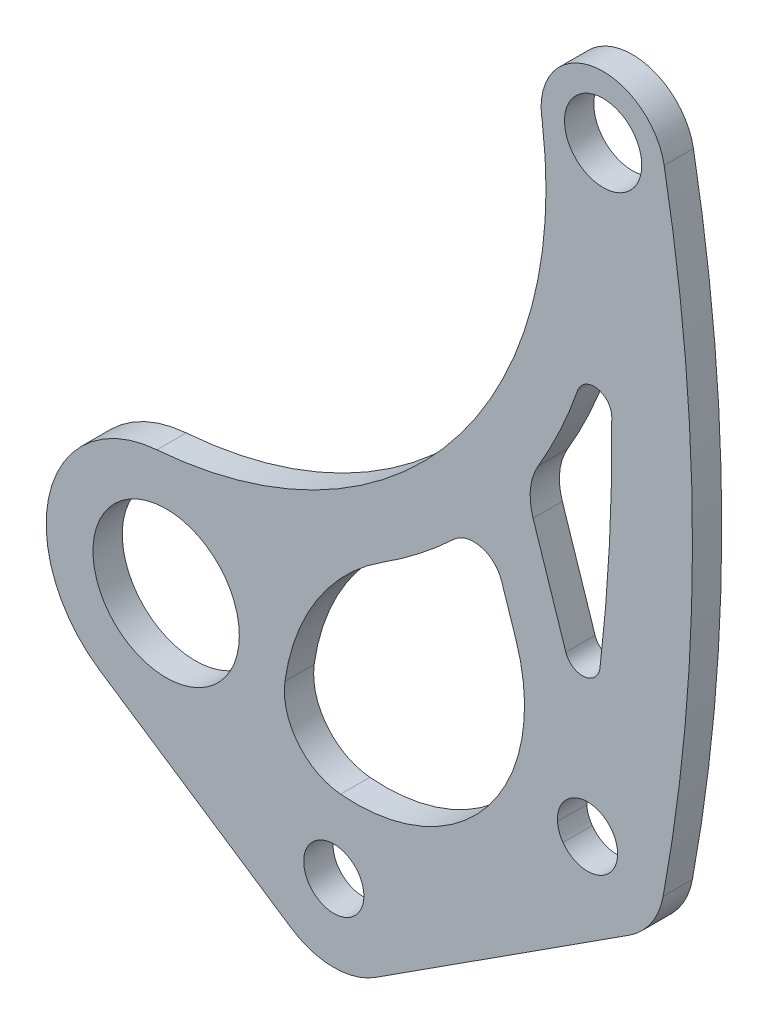
ISO-10303-21;
HEADER;
FILE_DESCRIPTION(('STEP AP214'),'2;1');
FILE_NAME('part.step','',(''),(''),'','','');
FILE_SCHEMA(('AUTOMOTIVE_DESIGN { 1 0 10303 214 1 1 1 1 }'));
ENDSEC;
DATA;
#1=APPLICATION_CONTEXT('core data for automotive mechanical design processes');
#2=APPLICATION_PROTOCOL_DEFINITION('international standard','automotive_design',2000,#1);
#3=PRODUCT_CONTEXT('',#1,'mechanical');
#4=PRODUCT('Part','Part','',(#3));
#5=PRODUCT_RELATED_PRODUCT_CATEGORY('part','',(#4));
#6=PRODUCT_DEFINITION_FORMATION('','',#4);
#7=PRODUCT_DEFINITION_CONTEXT('part definition',#1,'design');
#8=PRODUCT_DEFINITION('design','',#6,#7);
#9=PRODUCT_DEFINITION_SHAPE('','',#8);
#10=(LENGTH_UNIT() NAMED_UNIT(*) SI_UNIT(.MILLI.,.METRE.));
#11=(NAMED_UNIT(*) PLANE_ANGLE_UNIT() SI_UNIT($,.RADIAN.));
#12=(NAMED_UNIT(*) SI_UNIT($,.STERADIAN.) SOLID_ANGLE_UNIT());
#13=UNCERTAINTY_MEASURE_WITH_UNIT(LENGTH_MEASURE(1.E-05),#10,'distance_accuracy_value','');
#14=(GEOMETRIC_REPRESENTATION_CONTEXT(3) GLOBAL_UNCERTAINTY_ASSIGNED_CONTEXT((#13)) GLOBAL_UNIT_ASSIGNED_CONTEXT((#10,
#11,#12)) REPRESENTATION_CONTEXT('',''));
#15=CARTESIAN_POINT('',(0.,0.,0.));
#16=DIRECTION('',(0.,0.,1.));
#17=DIRECTION('',(1.,0.,0.));
#18=AXIS2_PLACEMENT_3D('',#15,#16,#17);
#19=CARTESIAN_POINT('',(-4.50533240745612,58.5644592406378,3.175));
#20=DIRECTION('',(0.,0.,-1.));
#21=DIRECTION('',(-1.,0.,0.));
#22=AXIS2_PLACEMENT_3D('',#19,#20,#21);
#23=CYLINDRICAL_SURFACE('',#22,52.07);
#24=CARTESIAN_POINT('',(-4.50533240745612,58.5644592406378,0.));
#25=DIRECTION('',(0.,0.,1.));
#26=DIRECTION('',(1.,0.,0.));
#27=AXIS2_PLACEMENT_3D('',#24,#25,#26);
#28=CIRCLE('',#27,52.07);
#29=CARTESIAN_POINT('',(23.480081983868,14.6543068684828,0.));
#30=VERTEX_POINT('',#29);
#31=CARTESIAN_POINT('',(31.2033161381692,20.667529034551,0.));
#32=VERTEX_POINT('',#31);
#33=EDGE_CURVE('E329',#30,#32,#28,.T.);
#34=ORIENTED_EDGE('',*,*,#33,.T.);
#35=DIRECTION('',(0.,0.,-1.));
#36=VECTOR('',#35,1.);
#37=CARTESIAN_POINT('',(31.2033161381692,20.667529034551,3.175));
#38=LINE('',#37,#36);
#39=CARTESIAN_POINT('',(31.2033161381692,20.667529034551,3.175));
#40=VERTEX_POINT('',#39);
#41=EDGE_CURVE('E65',#32,#40,#38,.F.);
#42=ORIENTED_EDGE('',*,*,#41,.T.);
#43=CARTESIAN_POINT('',(-4.50533240745612,58.5644592406378,3.175));
#44=DIRECTION('',(0.,0.,1.));
#45=DIRECTION('',(1.,0.,0.));
#46=AXIS2_PLACEMENT_3D('',#43,#44,#45);
#47=CIRCLE('',#46,52.07);
#48=CARTESIAN_POINT('',(23.480081983868,14.6543068684828,3.175));
#49=VERTEX_POINT('',#48);
#50=EDGE_CURVE('E280',#49,#40,#47,.T.);
#51=ORIENTED_EDGE('',*,*,#50,.F.);
#52=DIRECTION('',(0.,0.,1.));
#53=VECTOR('',#52,1.);
#54=CARTESIAN_POINT('',(23.480081983868,14.6543068684828,0.));
#55=LINE('',#54,#53);
#56=EDGE_CURVE('E244',#30,#49,#55,.T.);
#57=ORIENTED_EDGE('',*,*,#56,.F.);
#58=EDGE_LOOP('',(#34,#42,#51,#57));
#59=FACE_BOUND('',#58,.T.);
#60=ADVANCED_FACE('F50',(#59),#23,.T.);
#61=CARTESIAN_POINT('',(45.72,0.,3.175));
#62=DIRECTION('',(0.,0.,-1.));
#63=DIRECTION('',(-1.,0.,0.));
#64=AXIS2_PLACEMENT_3D('',#61,#62,#63);
#65=CYLINDRICAL_SURFACE('',#64,3.2639);
#66=CARTESIAN_POINT('',(45.72,0.,0.));
#67=DIRECTION('',(0.,0.,1.));
#68=DIRECTION('',(1.,0.,0.));
#69=AXIS2_PLACEMENT_3D('',#66,#67,#68);
#70=CIRCLE('',#69,3.2639);
#71=CARTESIAN_POINT('',(42.4625763798194,-0.205510507492002,0.));
#72=VERTEX_POINT('',#71);
#73=CARTESIAN_POINT('',(43.0519360241002,-1.88002069948861,0.));
#74=VERTEX_POINT('',#73);
#75=EDGE_CURVE('E341',#72,#74,#70,.T.);
#76=ORIENTED_EDGE('',*,*,#75,.F.);
#77=DIRECTION('',(0.,0.,1.));
#78=VECTOR('',#77,1.);
#79=CARTESIAN_POINT('',(42.4625763798194,-0.205510507492002,3.175));
#80=LINE('',#79,#78);
#81=CARTESIAN_POINT('',(42.4625763798194,-0.205510507492002,3.175));
#82=VERTEX_POINT('',#81);
#83=EDGE_CURVE('E382',#72,#82,#80,.T.);
#84=ORIENTED_EDGE('',*,*,#83,.T.);
#85=CARTESIAN_POINT('',(45.72,0.,3.175));
#86=DIRECTION('',(0.,0.,1.));
#87=DIRECTION('',(1.,0.,0.));
#88=AXIS2_PLACEMENT_3D('',#85,#86,#87);
#89=CIRCLE('',#88,3.2639);
#90=CARTESIAN_POINT('',(43.0519360241002,-1.88002069948861,3.175));
#91=VERTEX_POINT('',#90);
#92=EDGE_CURVE('E293',#82,#91,#89,.T.);
#93=ORIENTED_EDGE('',*,*,#92,.T.);
#94=DIRECTION('',(0.,0.,1.));
#95=VECTOR('',#94,1.);
#96=CARTESIAN_POINT('',(43.0519360241002,-1.88002069948861,3.175));
#97=LINE('',#96,#95);
#98=EDGE_CURVE('E371',#74,#91,#97,.T.);
#99=ORIENTED_EDGE('',*,*,#98,.F.);
#100=EDGE_LOOP('',(#76,#84,#93,#99));
#101=FACE_BOUND('',#100,.T.);
#102=ADVANCED_FACE('F442',(#101),#65,.F.);
#103=CARTESIAN_POINT('',(48.9774236201806,0.205510507492002,3.175));
#104=VERTEX_POINT('',#103);
#105=EDGE_CURVE('E294',#91,#104,#89,.T.);
#106=ORIENTED_EDGE('',*,*,#105,.T.);
#107=DIRECTION('',(0.,0.,-1.));
#108=VECTOR('',#107,1.);
#109=CARTESIAN_POINT('',(48.9774236201806,0.205510507492002,3.175));
#110=LINE('',#109,#108);
#111=CARTESIAN_POINT('',(48.9774236201806,0.205510507492002,0.));
#112=VERTEX_POINT('',#111);
#113=EDGE_CURVE('E379',#104,#112,#110,.T.);
#114=ORIENTED_EDGE('',*,*,#113,.T.);
#115=EDGE_CURVE('E342',#74,#112,#70,.T.);
#116=ORIENTED_EDGE('',*,*,#115,.F.);
#117=ORIENTED_EDGE('',*,*,#98,.T.);
#118=EDGE_LOOP('',(#106,#114,#116,#117));
#119=FACE_BOUND('',#118,.T.);
#120=ADVANCED_FACE('F449',(#119),#65,.F.);
#121=ORIENTED_EDGE('',*,*,#113,.F.);
#122=CARTESIAN_POINT('',(48.3880639758998,1.88002069948861,3.175));
#123=VERTEX_POINT('',#122);
#124=EDGE_CURVE('E298',#104,#123,#89,.T.);
#125=ORIENTED_EDGE('',*,*,#124,.T.);
#126=DIRECTION('',(0.,0.,-1.));
#127=VECTOR('',#126,1.);
#128=CARTESIAN_POINT('',(48.3880639758998,1.88002069948861,3.175));
#129=LINE('',#128,#127);
#130=CARTESIAN_POINT('',(48.3880639758998,1.88002069948861,0.));
#131=VERTEX_POINT('',#130);
#132=EDGE_CURVE('E375',#123,#131,#129,.T.);
#133=ORIENTED_EDGE('',*,*,#132,.T.);
#134=EDGE_CURVE('E346',#112,#131,#70,.T.);
#135=ORIENTED_EDGE('',*,*,#134,.F.);
#136=EDGE_LOOP('',(#121,#125,#133,#135));
#137=FACE_BOUND('',#136,.T.);
#138=ADVANCED_FACE('F457',(#137),#65,.F.);
#139=CARTESIAN_POINT('',(40.3709543283503,32.1560554871792,3.175));
#140=VERTEX_POINT('',#139);
#141=CARTESIAN_POINT('',(44.646607754843,41.3780786361658,3.175));
#142=VERTEX_POINT('',#141);
#143=EDGE_CURVE('E283',#140,#142,#47,.T.);
#144=ORIENTED_EDGE('',*,*,#143,.F.);
#145=DIRECTION('',(0.,0.,-1.));
#146=VECTOR('',#145,1.);
#147=CARTESIAN_POINT('',(40.3709543283503,32.1560554871792,3.175));
#148=LINE('',#147,#146);
#149=CARTESIAN_POINT('',(40.3709543283503,32.1560554871792,0.));
#150=VERTEX_POINT('',#149);
#151=EDGE_CURVE('E407',#140,#150,#148,.T.);
#152=ORIENTED_EDGE('',*,*,#151,.T.);
#153=CARTESIAN_POINT('',(44.646607754843,41.3780786361658,0.));
#154=VERTEX_POINT('',#153);
#155=EDGE_CURVE('E332',#150,#154,#28,.T.);
#156=ORIENTED_EDGE('',*,*,#155,.T.);
#157=DIRECTION('',(0.,0.,-1.));
#158=VECTOR('',#157,1.);
#159=CARTESIAN_POINT('',(44.646607754843,41.3780786361658,3.175));
#160=LINE('',#159,#158);
#161=EDGE_CURVE('E394',#154,#142,#160,.F.);
#162=ORIENTED_EDGE('',*,*,#161,.T.);
#163=EDGE_LOOP('',(#144,#152,#156,#162));
#164=FACE_BOUND('',#163,.T.);
#165=ADVANCED_FACE('F444',(#164),#23,.T.);
#166=CARTESIAN_POINT('',(-142.138533342949,38.656045003802,3.175));
#167=DIRECTION('',(0.,0.,-1.));
#168=DIRECTION('',(-1.,0.,0.));
#169=AXIS2_PLACEMENT_3D('',#166,#167,#168);
#170=CYLINDRICAL_SURFACE('',#169,190.5);
#171=CARTESIAN_POINT('',(-142.138533342949,38.656045003802,0.));
#172=DIRECTION('',(0.,0.,1.));
#173=DIRECTION('',(1.,0.,0.));
#174=AXIS2_PLACEMENT_3D('',#171,#172,#173);
#175=CIRCLE('',#174,190.5);
#176=CARTESIAN_POINT('',(47.0702030784157,16.5132343910918,0.));
#177=VERTEX_POINT('',#176);
#178=CARTESIAN_POINT('',(48.3497321227549,40.7704526909221,0.));
#179=VERTEX_POINT('',#178);
#180=EDGE_CURVE('E337',#177,#179,#175,.T.);
#181=ORIENTED_EDGE('',*,*,#180,.F.);
#182=DIRECTION('',(0.,0.,-1.));
#183=VECTOR('',#182,1.);
#184=CARTESIAN_POINT('',(47.0702030784158,16.5132343910918,3.175));
#185=LINE('',#184,#183);
#186=CARTESIAN_POINT('',(47.0702030784157,16.5132343910918,3.175));
#187=VERTEX_POINT('',#186);
#188=EDGE_CURVE('E392',#177,#187,#185,.F.);
#189=ORIENTED_EDGE('',*,*,#188,.T.);
#190=CARTESIAN_POINT('',(-142.138533342949,38.656045003802,3.175));
#191=DIRECTION('',(0.,0.,1.));
#192=DIRECTION('',(1.,0.,0.));
#193=AXIS2_PLACEMENT_3D('',#190,#191,#192);
#194=CIRCLE('',#193,190.5);
#195=CARTESIAN_POINT('',(48.3497321227549,40.7704526909221,3.175));
#196=VERTEX_POINT('',#195);
#197=EDGE_CURVE('E288',#187,#196,#194,.T.);
#198=ORIENTED_EDGE('',*,*,#197,.T.);
#199=DIRECTION('',(0.,0.,-1.));
#200=VECTOR('',#199,1.);
#201=CARTESIAN_POINT('',(48.3497321227549,40.7704526909221,3.175));
#202=LINE('',#201,#200);
#203=EDGE_CURVE('E389',#196,#179,#202,.T.);
#204=ORIENTED_EDGE('',*,*,#203,.T.);
#205=EDGE_LOOP('',(#181,#189,#198,#204));
#206=FACE_BOUND('',#205,.T.);
#207=ADVANCED_FACE('F456',(#206),#170,.F.);
#208=CARTESIAN_POINT('',(38.586011370491,12.6938979852854,3.175));
#209=DIRECTION('',(0.949917524329056,0.312500715155272,0.));
#210=DIRECTION('',(-0.312500715155272,0.949917524329057,0.));
#211=AXIS2_PLACEMENT_3D('',#208,#209,#210);
#212=PLANE('',#211);
#213=DIRECTION('',(0.312500715155272,-0.949917524329057,0.));
#214=VECTOR('',#213,1.);
#215=CARTESIAN_POINT('',(38.586011370491,12.6938979852854,3.175));
#216=LINE('',#215,#214);
#217=CARTESIAN_POINT('',(36.3966608965496,19.3489303779686,3.175));
#218=VERTEX_POINT('',#217);
#219=CARTESIAN_POINT('',(37.9672470665697,14.574773859224,3.175));
#220=VERTEX_POINT('',#219);
#221=EDGE_CURVE('E282',#218,#220,#216,.T.);
#222=ORIENTED_EDGE('',*,*,#221,.F.);
#223=DIRECTION('',(0.,0.,1.));
#224=VECTOR('',#223,1.);
#225=CARTESIAN_POINT('',(36.3966608965496,19.3489303779686,0.));
#226=LINE('',#225,#224);
#227=CARTESIAN_POINT('',(36.3966608965496,19.3489303779686,0.));
#228=VERTEX_POINT('',#227);
#229=EDGE_CURVE('E416',#218,#228,#226,.F.);
#230=ORIENTED_EDGE('',*,*,#229,.T.);
#231=DIRECTION('',(0.312500715155272,-0.949917524329057,0.));
#232=VECTOR('',#231,1.);
#233=CARTESIAN_POINT('',(38.586011370491,12.6938979852854,0.));
#234=LINE('',#233,#232);
#235=CARTESIAN_POINT('',(37.9672470665697,14.574773859224,0.));
#236=VERTEX_POINT('',#235);
#237=EDGE_CURVE('E331',#228,#236,#234,.T.);
#238=ORIENTED_EDGE('',*,*,#237,.T.);
#239=DIRECTION('',(0.,0.,1.));
#240=VECTOR('',#239,1.);
#241=CARTESIAN_POINT('',(37.9672470665697,14.574773859224,0.));
#242=LINE('',#241,#240);
#243=EDGE_CURVE('E225',#236,#220,#242,.T.);
#244=ORIENTED_EDGE('',*,*,#243,.T.);
#245=EDGE_LOOP('',(#222,#230,#238,#244));
#246=FACE_BOUND('',#245,.T.);
#247=ADVANCED_FACE('F422',(#246),#212,.F.);
#248=CARTESIAN_POINT('',(-133.393338272466,33.1550421520357,3.175));
#249=DIRECTION('',(0.,0.,-1.));
#250=DIRECTION('',(-1.,0.,0.));
#251=AXIS2_PLACEMENT_3D('',#248,#249,#250);
#252=CYLINDRICAL_SURFACE('',#251,190.5);
#253=CARTESIAN_POINT('',(-133.393338272466,33.1550421520357,0.));
#254=DIRECTION('',(0.,0.,1.));
#255=DIRECTION('',(1.,0.,0.));
#256=AXIS2_PLACEMENT_3D('',#253,#254,#255);
#257=CIRCLE('',#256,190.5);
#258=CARTESIAN_POINT('',(53.9245222927567,-1.51871036002841,0.));
#259=VERTEX_POINT('',#258);
#260=CARTESIAN_POINT('',(54.0358306347205,67.2219857008992,0.));
#261=VERTEX_POINT('',#260);
#262=EDGE_CURVE('E253',#259,#261,#257,.T.);
#263=ORIENTED_EDGE('',*,*,#262,.T.);
#264=DIRECTION('',(0.,0.,-1.));
#265=VECTOR('',#264,1.);
#266=CARTESIAN_POINT('',(54.0358306347205,67.2219857008992,3.175));
#267=LINE('',#266,#265);
#268=CARTESIAN_POINT('',(54.0358306347205,67.2219857008992,3.175));
#269=VERTEX_POINT('',#268);
#270=EDGE_CURVE('E368',#269,#261,#267,.T.);
#271=ORIENTED_EDGE('',*,*,#270,.F.);
#272=CARTESIAN_POINT('',(-133.393338272466,33.1550421520357,3.175));
#273=DIRECTION('',(0.,0.,1.));
#274=DIRECTION('',(1.,0.,0.));
#275=AXIS2_PLACEMENT_3D('',#272,#273,#274);
#276=CIRCLE('',#275,190.5);
#277=CARTESIAN_POINT('',(53.9245222927567,-1.51871036002841,3.175));
#278=VERTEX_POINT('',#277);
#279=EDGE_CURVE('E254',#278,#269,#276,.T.);
#280=ORIENTED_EDGE('',*,*,#279,.F.);
#281=DIRECTION('',(0.,0.,-1.));
#282=VECTOR('',#281,1.);
#283=CARTESIAN_POINT('',(53.9245222927567,-1.51871036002841,3.175));
#284=LINE('',#283,#282);
#285=EDGE_CURVE('E302',#278,#259,#284,.T.);
#286=ORIENTED_EDGE('',*,*,#285,.T.);
#287=EDGE_LOOP('',(#263,#271,#280,#286));
#288=FACE_BOUND('',#287,.T.);
#289=ADVANCED_FACE('F535',(#288),#252,.T.);
#290=CARTESIAN_POINT('',(47.4133333333333,66.0182870288394,3.175));
#291=DIRECTION('',(0.,0.,-1.));
#292=DIRECTION('',(-1.,0.,0.));
#293=AXIS2_PLACEMENT_3D('',#290,#291,#292);
#294=CYLINDRICAL_SURFACE('',#293,6.73099999999993);
#295=CARTESIAN_POINT('',(47.4133333333333,66.0182870288394,0.));
#296=DIRECTION('',(0.,0.,1.));
#297=DIRECTION('',(1.,0.,0.));
#298=AXIS2_PLACEMENT_3D('',#295,#296,#297);
#299=CIRCLE('',#298,6.73099999999993);
#300=CARTESIAN_POINT('',(40.8591949138478,64.4854365539976,0.));
#301=VERTEX_POINT('',#300);
#302=EDGE_CURVE('E305',#261,#301,#299,.T.);
#303=ORIENTED_EDGE('',*,*,#302,.T.);
#304=DIRECTION('',(0.,0.,-1.));
#305=VECTOR('',#304,1.);
#306=CARTESIAN_POINT('',(40.8591949138478,64.4854365539976,3.175));
#307=LINE('',#306,#305);
#308=CARTESIAN_POINT('',(40.8591949138478,64.4854365539976,3.175));
#309=VERTEX_POINT('',#308);
#310=EDGE_CURVE('E366',#309,#301,#307,.T.);
#311=ORIENTED_EDGE('',*,*,#310,.F.);
#312=CARTESIAN_POINT('',(47.4133333333333,66.0182870288394,3.175));
#313=DIRECTION('',(0.,0.,1.));
#314=DIRECTION('',(1.,0.,0.));
#315=AXIS2_PLACEMENT_3D('',#312,#313,#314);
#316=CIRCLE('',#315,6.73099999999993);
#317=EDGE_CURVE('E257',#269,#309,#316,.T.);
#318=ORIENTED_EDGE('',*,*,#317,.F.);
#319=ORIENTED_EDGE('',*,*,#270,.T.);
#320=EDGE_LOOP('',(#303,#311,#318,#319));
#321=FACE_BOUND('',#320,.T.);
#322=ADVANCED_FACE('F561',(#321),#294,.T.);
#323=CARTESIAN_POINT('',(-6.2268221741051,4.92245790861365,3.175));
#324=DIRECTION('',(-0.784481533745524,0.620152177463137,0.));
#325=DIRECTION('',(-0.620152177463137,-0.784481533745524,0.));
#326=AXIS2_PLACEMENT_3D('',#323,#324,#325);
#327=PLANE('',#326);
#328=DIRECTION('',(0.620152177463137,0.784481533745524,0.));
#329=VECTOR('',#328,1.);
#330=CARTESIAN_POINT('',(-6.2268221741051,4.92245790861365,0.));
#331=LINE('',#330,#329);
#332=CARTESIAN_POINT('',(40.8338272840695,64.4533469510919,0.));
#333=VERTEX_POINT('',#332);
#334=EDGE_CURVE('E308',#333,#301,#331,.T.);
#335=ORIENTED_EDGE('',*,*,#334,.F.);
#336=DIRECTION('',(0.,0.,-1.));
#337=VECTOR('',#336,1.);
#338=CARTESIAN_POINT('',(40.8338272840695,64.4533469510919,3.175));
#339=LINE('',#338,#337);
#340=CARTESIAN_POINT('',(40.8338272840695,64.4533469510919,3.175));
#341=VERTEX_POINT('',#340);
#342=EDGE_CURVE('E364',#341,#333,#339,.T.);
#343=ORIENTED_EDGE('',*,*,#342,.F.);
#344=DIRECTION('',(0.620152177463137,0.784481533745524,0.));
#345=VECTOR('',#344,1.);
#346=CARTESIAN_POINT('',(-6.2268221741051,4.92245790861365,3.175));
#347=LINE('',#346,#345);
#348=EDGE_CURVE('E260',#341,#309,#347,.T.);
#349=ORIENTED_EDGE('',*,*,#348,.T.);
#350=ORIENTED_EDGE('',*,*,#310,.T.);
#351=EDGE_LOOP('',(#335,#343,#349,#350));
#352=FACE_BOUND('',#351,.T.);
#353=ADVANCED_FACE('F557',(#352),#327,.T.);
#354=CARTESIAN_POINT('',(-4.50533240745612,58.5644592406378,3.175));
#355=DIRECTION('',(0.,0.,-1.));
#356=DIRECTION('',(-1.,0.,0.));
#357=AXIS2_PLACEMENT_3D('',#354,#355,#356);
#358=CYLINDRICAL_SURFACE('',#357,45.72);
#359=CARTESIAN_POINT('',(-4.50533240745612,58.5644592406378,0.));
#360=DIRECTION('',(0.,0.,1.));
#361=DIRECTION('',(1.,0.,0.));
#362=AXIS2_PLACEMENT_3D('',#359,#360,#361);
#363=CIRCLE('',#362,45.72);
#364=CARTESIAN_POINT('',(-0.99847907408487,12.9791504263035,0.));
#365=VERTEX_POINT('',#364);
#366=EDGE_CURVE('E311',#365,#333,#363,.T.);
#367=ORIENTED_EDGE('',*,*,#366,.F.);
#368=DIRECTION('',(0.,0.,-1.));
#369=VECTOR('',#368,1.);
#370=CARTESIAN_POINT('',(-0.99847907408487,12.9791504263035,3.175));
#371=LINE('',#370,#369);
#372=CARTESIAN_POINT('',(-0.99847907408487,12.9791504263035,3.175));
#373=VERTEX_POINT('',#372);
#374=EDGE_CURVE('E362',#373,#365,#371,.T.);
#375=ORIENTED_EDGE('',*,*,#374,.F.);
#376=CARTESIAN_POINT('',(-4.50533240745612,58.5644592406378,3.175));
#377=DIRECTION('',(0.,0.,1.));
#378=DIRECTION('',(1.,0.,0.));
#379=AXIS2_PLACEMENT_3D('',#376,#377,#378);
#380=CIRCLE('',#379,45.72);
#381=EDGE_CURVE('E263',#373,#341,#380,.T.);
#382=ORIENTED_EDGE('',*,*,#381,.T.);
#383=ORIENTED_EDGE('',*,*,#342,.T.);
#384=EDGE_LOOP('',(#367,#375,#382,#383));
#385=FACE_BOUND('',#384,.T.);
#386=ADVANCED_FACE('F553',(#385),#358,.F.);
#387=CARTESIAN_POINT('',(0.,0.,3.175));
#388=DIRECTION('',(0.,0.,-1.));
#389=DIRECTION('',(-1.,0.,0.));
#390=AXIS2_PLACEMENT_3D('',#387,#388,#389);
#391=CYLINDRICAL_SURFACE('',#390,13.0175);
#392=CARTESIAN_POINT('',(0.,0.,0.));
#393=DIRECTION('',(0.,0.,1.));
#394=DIRECTION('',(1.,0.,0.));
#395=AXIS2_PLACEMENT_3D('',#392,#393,#394);
#396=CIRCLE('',#395,13.0175);
#397=CARTESIAN_POINT('',(-7.21406716575271,-10.835706768735,0.));
#398=VERTEX_POINT('',#397);
#399=EDGE_CURVE('E314',#365,#398,#396,.T.);
#400=ORIENTED_EDGE('',*,*,#399,.T.);
#401=DIRECTION('',(0.,0.,-1.));
#402=VECTOR('',#401,1.);
#403=CARTESIAN_POINT('',(-7.21406716575271,-10.835706768735,3.175));
#404=LINE('',#403,#402);
#405=CARTESIAN_POINT('',(-7.21406716575271,-10.835706768735,3.175));
#406=VERTEX_POINT('',#405);
#407=EDGE_CURVE('E359',#406,#398,#404,.T.);
#408=ORIENTED_EDGE('',*,*,#407,.F.);
#409=CARTESIAN_POINT('',(0.,0.,3.175));
#410=DIRECTION('',(0.,0.,1.));
#411=DIRECTION('',(1.,0.,0.));
#412=AXIS2_PLACEMENT_3D('',#409,#410,#411);
#413=CIRCLE('',#412,13.0175);
#414=EDGE_CURVE('E266',#373,#406,#413,.T.);
#415=ORIENTED_EDGE('',*,*,#414,.F.);
#416=ORIENTED_EDGE('',*,*,#374,.T.);
#417=EDGE_LOOP('',(#400,#408,#415,#416));
#418=FACE_BOUND('',#417,.T.);
#419=ADVANCED_FACE('F549',(#418),#391,.T.);
#420=CARTESIAN_POINT('',(-7.21406716575272,-10.835706768735,3.175));
#421=DIRECTION('',(0.554182228980427,0.832395373054347,0.));
#422=DIRECTION('',(-0.832395373054347,0.554182228980427,0.));
#423=AXIS2_PLACEMENT_3D('',#420,#421,#422);
#424=PLANE('',#423);
#425=DIRECTION('',(0.832395373054347,-0.554182228980427,0.));
#426=VECTOR('',#425,1.);
#427=CARTESIAN_POINT('',(-7.21406716575272,-10.835706768735,0.));
#428=LINE('',#427,#426);
#429=CARTESIAN_POINT('',(13.56778756395,-24.6716012838552,0.));
#430=VERTEX_POINT('',#429);
#431=EDGE_CURVE('E316',#398,#430,#428,.T.);
#432=ORIENTED_EDGE('',*,*,#431,.T.);
#433=DIRECTION('',(0.,0.,-1.));
#434=VECTOR('',#433,1.);
#435=CARTESIAN_POINT('',(13.56778756395,-24.6716012838552,3.175));
#436=LINE('',#435,#434);
#437=CARTESIAN_POINT('',(13.56778756395,-24.6716012838552,3.175));
#438=VERTEX_POINT('',#437);
#439=EDGE_CURVE('E356',#438,#430,#436,.T.);
#440=ORIENTED_EDGE('',*,*,#439,.F.);
#441=DIRECTION('',(0.832395373054347,-0.554182228980427,0.));
#442=VECTOR('',#441,1.);
#443=CARTESIAN_POINT('',(-7.21406716575272,-10.835706768735,3.175));
#444=LINE('',#443,#442);
#445=EDGE_CURVE('E268',#406,#438,#444,.T.);
#446=ORIENTED_EDGE('',*,*,#445,.F.);
#447=ORIENTED_EDGE('',*,*,#407,.T.);
#448=EDGE_LOOP('',(#432,#440,#446,#447));
#449=FACE_BOUND('',#448,.T.);
#450=ADVANCED_FACE('F545',(#449),#424,.F.);
#451=CARTESIAN_POINT('',(18.1918286643398,-17.726177530627,3.175));
#452=DIRECTION('',(0.,0.,-1.));
#453=DIRECTION('',(-1.,0.,0.));
#454=AXIS2_PLACEMENT_3D('',#451,#452,#453);
#455=CYLINDRICAL_SURFACE('',#454,8.3439);
#456=CARTESIAN_POINT('',(18.1918286643398,-17.726177530627,0.));
#457=DIRECTION('',(0.,0.,1.));
#458=DIRECTION('',(1.,0.,0.));
#459=AXIS2_PLACEMENT_3D('',#456,#457,#458);
#460=CIRCLE('',#459,8.3439);
#461=CARTESIAN_POINT('',(22.7091733526832,-24.7414654204214,0.));
#462=VERTEX_POINT('',#461);
#463=EDGE_CURVE('E318',#430,#462,#460,.T.);
#464=ORIENTED_EDGE('',*,*,#463,.T.);
#465=DIRECTION('',(0.,0.,-1.));
#466=VECTOR('',#465,1.);
#467=CARTESIAN_POINT('',(22.7091733526832,-24.7414654204214,3.175));
#468=LINE('',#467,#466);
#469=CARTESIAN_POINT('',(22.7091733526832,-24.7414654204214,3.175));
#470=VERTEX_POINT('',#469);
#471=EDGE_CURVE('E354',#470,#462,#468,.T.);
#472=ORIENTED_EDGE('',*,*,#471,.F.);
#473=CARTESIAN_POINT('',(18.1918286643398,-17.726177530627,3.175));
#474=DIRECTION('',(0.,0.,1.));
#475=DIRECTION('',(1.,0.,0.));
#476=AXIS2_PLACEMENT_3D('',#473,#474,#475);
#477=CIRCLE('',#476,8.3439);
#478=EDGE_CURVE('E270',#438,#470,#477,.T.);
#479=ORIENTED_EDGE('',*,*,#478,.F.);
#480=ORIENTED_EDGE('',*,*,#439,.T.);
#481=EDGE_LOOP('',(#464,#472,#479,#480));
#482=FACE_BOUND('',#481,.T.);
#483=ADVANCED_FACE('F541',(#482),#455,.T.);
#484=CARTESIAN_POINT('',(17.9182611700613,-27.8264709170555,3.175));
#485=DIRECTION('',(0.541394873901105,-0.840768452377708,0.));
#486=DIRECTION('',(0.840768452377708,0.541394873901105,0.));
#487=AXIS2_PLACEMENT_3D('',#484,#485,#486);
#488=PLANE('',#487);
#489=DIRECTION('',(-0.840768452377708,-0.541394873901105,0.));
#490=VECTOR('',#489,1.);
#491=CARTESIAN_POINT('',(17.9182611700613,-27.8264709170555,0.));
#492=LINE('',#491,#490);
#493=CARTESIAN_POINT('',(50.2373446883434,-7.01528788979437,0.));
#494=VERTEX_POINT('',#493);
#495=EDGE_CURVE('E321',#494,#462,#492,.T.);
#496=ORIENTED_EDGE('',*,*,#495,.F.);
#497=DIRECTION('',(0.,0.,-1.));
#498=VECTOR('',#497,1.);
#499=CARTESIAN_POINT('',(50.2373446883434,-7.01528788979437,3.175));
#500=LINE('',#499,#498);
#501=CARTESIAN_POINT('',(50.2373446883434,-7.01528788979437,3.175));
#502=VERTEX_POINT('',#501);
#503=EDGE_CURVE('E352',#502,#494,#500,.T.);
#504=ORIENTED_EDGE('',*,*,#503,.F.);
#505=DIRECTION('',(-0.840768452377708,-0.541394873901105,0.));
#506=VECTOR('',#505,1.);
#507=CARTESIAN_POINT('',(17.9182611700613,-27.8264709170555,3.175));
#508=LINE('',#507,#506);
#509=EDGE_CURVE('E272',#502,#470,#508,.T.);
#510=ORIENTED_EDGE('',*,*,#509,.T.);
#511=ORIENTED_EDGE('',*,*,#471,.T.);
#512=EDGE_LOOP('',(#496,#504,#510,#511));
#513=FACE_BOUND('',#512,.T.);
#514=ADVANCED_FACE('F519',(#513),#488,.T.);
#515=ORIENTED_EDGE('',*,*,#83,.F.);
#516=EDGE_CURVE('E347',#131,#72,#70,.T.);
#517=ORIENTED_EDGE('',*,*,#516,.F.);
#518=ORIENTED_EDGE('',*,*,#132,.F.);
#519=EDGE_CURVE('E299',#123,#82,#89,.T.);
#520=ORIENTED_EDGE('',*,*,#519,.T.);
#521=EDGE_LOOP('',(#515,#517,#518,#520));
#522=FACE_BOUND('',#521,.T.);
#523=ADVANCED_FACE('F452',(#522),#65,.F.);
#524=CARTESIAN_POINT('',(43.9242602583384,14.4500573911322,3.175));
#525=DIRECTION('',(0.949917524329056,0.312500715155273,0.));
#526=DIRECTION('',(-0.312500715155273,0.949917524329056,0.));
#527=AXIS2_PLACEMENT_3D('',#524,#525,#526);
#528=PLANE('',#527);
#529=DIRECTION('',(0.312500715155273,-0.949917524329056,0.));
#530=VECTOR('',#529,1.);
#531=CARTESIAN_POINT('',(43.9242602583384,14.4500573911322,0.));
#532=LINE('',#531,#530);
#533=CARTESIAN_POINT('',(39.8116959434713,26.9511389028385,0.));
#534=VERTEX_POINT('',#533);
#535=CARTESIAN_POINT('',(43.3685228303553,16.1393486348481,0.));
#536=VERTEX_POINT('',#535);
#537=EDGE_CURVE('E340',#534,#536,#532,.T.);
#538=ORIENTED_EDGE('',*,*,#537,.F.);
#539=DIRECTION('',(0.,0.,-1.));
#540=VECTOR('',#539,1.);
#541=CARTESIAN_POINT('',(39.8116959434713,26.9511389028385,3.175));
#542=LINE('',#541,#540);
#543=CARTESIAN_POINT('',(39.8116959434713,26.9511389028385,3.175));
#544=VERTEX_POINT('',#543);
#545=EDGE_CURVE('E410',#534,#544,#542,.F.);
#546=ORIENTED_EDGE('',*,*,#545,.T.);
#547=DIRECTION('',(0.312500715155273,-0.949917524329056,0.));
#548=VECTOR('',#547,1.);
#549=CARTESIAN_POINT('',(43.9242602583384,14.4500573911322,3.175));
#550=LINE('',#549,#548);
#551=CARTESIAN_POINT('',(43.3685228303553,16.1393486348481,3.175));
#552=VERTEX_POINT('',#551);
#553=EDGE_CURVE('E291',#544,#552,#550,.T.);
#554=ORIENTED_EDGE('',*,*,#553,.T.);
#555=DIRECTION('',(0.,0.,1.));
#556=VECTOR('',#555,1.);
#557=CARTESIAN_POINT('',(43.3685228303553,16.1393486348481,0.));
#558=LINE('',#557,#556);
#559=EDGE_CURVE('E386',#552,#536,#558,.F.);
#560=ORIENTED_EDGE('',*,*,#559,.T.);
#561=EDGE_LOOP('',(#538,#546,#554,#560));
#562=FACE_BOUND('',#561,.T.);
#563=ADVANCED_FACE('F482',(#562),#528,.T.);
#564=CARTESIAN_POINT('',(0.,0.,3.175));
#565=DIRECTION('',(0.,0.,-1.));
#566=DIRECTION('',(-1.,0.,0.));
#567=AXIS2_PLACEMENT_3D('',#564,#565,#566);
#568=CYLINDRICAL_SURFACE('',#567,7.9375);
#569=CARTESIAN_POINT('',(0.,0.,3.175));
#570=DIRECTION('',(0.,0.,1.));
#571=DIRECTION('',(1.,0.,0.));
#572=AXIS2_PLACEMENT_3D('',#569,#570,#571);
#573=CIRCLE('',#572,7.9375);
#574=CARTESIAN_POINT('',(7.9375,0.,3.175));
#575=VERTEX_POINT('',#574);
#576=EDGE_CURVE('E285',#575,#575,#573,.T.);
#577=ORIENTED_EDGE('',*,*,#576,.T.);
#578=EDGE_LOOP('',(#577));
#579=FACE_BOUND('',#578,.T.);
#580=CARTESIAN_POINT('',(0.,0.,0.));
#581=DIRECTION('',(0.,0.,1.));
#582=DIRECTION('',(1.,0.,0.));
#583=AXIS2_PLACEMENT_3D('',#580,#581,#582);
#584=CIRCLE('',#583,7.9375);
#585=CARTESIAN_POINT('',(7.9375,0.,0.));
#586=VERTEX_POINT('',#585);
#587=EDGE_CURVE('E334',#586,#586,#584,.T.);
#588=ORIENTED_EDGE('',*,*,#587,.F.);
#589=EDGE_LOOP('',(#588));
#590=FACE_BOUND('',#589,.T.);
#591=ADVANCED_FACE('F521',(#579,#590),#568,.F.);
#592=CARTESIAN_POINT('',(47.4133333333333,66.0182870288394,3.175));
#593=DIRECTION('',(0.,0.,-1.));
#594=DIRECTION('',(-1.,0.,0.));
#595=AXIS2_PLACEMENT_3D('',#592,#593,#594);
#596=CYLINDRICAL_SURFACE('',#595,4.1910000000001);
#597=CARTESIAN_POINT('',(47.4133333333333,66.0182870288394,3.175));
#598=DIRECTION('',(0.,0.,1.));
#599=DIRECTION('',(1.,0.,0.));
#600=AXIS2_PLACEMENT_3D('',#597,#598,#599);
#601=CIRCLE('',#600,4.1910000000001);
#602=CARTESIAN_POINT('',(51.6043333333335,66.0182870288394,3.175));
#603=VERTEX_POINT('',#602);
#604=EDGE_CURVE('E277',#603,#603,#601,.T.);
#605=ORIENTED_EDGE('',*,*,#604,.T.);
#606=EDGE_LOOP('',(#605));
#607=FACE_BOUND('',#606,.T.);
#608=CARTESIAN_POINT('',(47.4133333333333,66.0182870288394,0.));
#609=DIRECTION('',(0.,0.,1.));
#610=DIRECTION('',(1.,0.,0.));
#611=AXIS2_PLACEMENT_3D('',#608,#609,#610);
#612=CIRCLE('',#611,4.1910000000001);
#613=CARTESIAN_POINT('',(51.6043333333335,66.0182870288394,0.));
#614=VERTEX_POINT('',#613);
#615=EDGE_CURVE('E326',#614,#614,#612,.T.);
#616=ORIENTED_EDGE('',*,*,#615,.F.);
#617=EDGE_LOOP('',(#616));
#618=FACE_BOUND('',#617,.T.);
#619=ADVANCED_FACE('F525',(#607,#618),#596,.F.);
#620=CARTESIAN_POINT('',(45.72,0.,3.175));
#621=DIRECTION('',(0.,0.,-1.));
#622=DIRECTION('',(-1.,0.,0.));
#623=AXIS2_PLACEMENT_3D('',#620,#621,#622);
#624=CYLINDRICAL_SURFACE('',#623,8.3439);
#625=CARTESIAN_POINT('',(45.72,0.,0.));
#626=DIRECTION('',(0.,0.,1.));
#627=DIRECTION('',(1.,0.,0.));
#628=AXIS2_PLACEMENT_3D('',#625,#626,#627);
#629=CIRCLE('',#628,8.3439);
#630=EDGE_CURVE('E324',#494,#259,#629,.T.);
#631=ORIENTED_EDGE('',*,*,#630,.T.);
#632=ORIENTED_EDGE('',*,*,#285,.F.);
#633=CARTESIAN_POINT('',(45.72,0.,3.175));
#634=DIRECTION('',(0.,0.,1.));
#635=DIRECTION('',(1.,0.,0.));
#636=AXIS2_PLACEMENT_3D('',#633,#634,#635);
#637=CIRCLE('',#636,8.3439);
#638=EDGE_CURVE('E275',#502,#278,#637,.T.);
#639=ORIENTED_EDGE('',*,*,#638,.F.);
#640=ORIENTED_EDGE('',*,*,#503,.T.);
#641=EDGE_LOOP('',(#631,#632,#639,#640));
#642=FACE_BOUND('',#641,.T.);
#643=ADVANCED_FACE('F506',(#642),#624,.T.);
#644=CARTESIAN_POINT('',(18.1918286643398,-17.726177530627,3.175));
#645=DIRECTION('',(0.,0.,-1.));
#646=DIRECTION('',(-1.,0.,0.));
#647=AXIS2_PLACEMENT_3D('',#644,#645,#646);
#648=CYLINDRICAL_SURFACE('',#647,3.2639);
#649=CARTESIAN_POINT('',(18.1918286643398,-17.726177530627,3.175));
#650=DIRECTION('',(0.,0.,1.));
#651=DIRECTION('',(1.,0.,0.));
#652=AXIS2_PLACEMENT_3D('',#649,#650,#651);
#653=CIRCLE('',#652,3.2639);
#654=CARTESIAN_POINT('',(21.4557286643398,-17.726177530627,3.175));
#655=VERTEX_POINT('',#654);
#656=EDGE_CURVE('E297',#655,#655,#653,.T.);
#657=ORIENTED_EDGE('',*,*,#656,.T.);
#658=EDGE_LOOP('',(#657));
#659=FACE_BOUND('',#658,.T.);
#660=CARTESIAN_POINT('',(18.1918286643398,-17.726177530627,0.));
#661=DIRECTION('',(0.,0.,1.));
#662=DIRECTION('',(1.,0.,0.));
#663=AXIS2_PLACEMENT_3D('',#660,#661,#662);
#664=CIRCLE('',#663,3.2639);
#665=CARTESIAN_POINT('',(21.4557286643398,-17.726177530627,0.));
#666=VERTEX_POINT('',#665);
#667=EDGE_CURVE('E258',#666,#666,#664,.T.);
#668=ORIENTED_EDGE('',*,*,#667,.F.);
#669=EDGE_LOOP('',(#668));
#670=FACE_BOUND('',#669,.T.);
#671=ADVANCED_FACE('F496',(#659,#670),#648,.F.);
#672=CARTESIAN_POINT('',(0.,0.,3.175));
#673=DIRECTION('',(0.,0.,1.));
#674=DIRECTION('',(1.,0.,0.));
#675=AXIS2_PLACEMENT_3D('',#672,#673,#674);
#676=PLANE('',#675);
#677=CARTESIAN_POINT('',(20.5526651985329,8.84578250101602,3.175));
#678=DIRECTION('',(0.,0.,1.));
#679=DIRECTION('',(1.,0.,0.));
#680=AXIS2_PLACEMENT_3D('',#677,#678,#679);
#681=CIRCLE('',#680,18.3327303918695);
#682=CARTESIAN_POINT('',(18.9302496593564,-9.41501626133866,3.175));
#683=VERTEX_POINT('',#682);
#684=EDGE_CURVE('E226',#683,#220,#681,.T.);
#685=ORIENTED_EDGE('',*,*,#684,.F.);
#686=CARTESIAN_POINT('',(19.5229530139756,-2.7439530083529,3.175));
#687=DIRECTION('',(0.,0.,1.));
#688=DIRECTION('',(1.,0.,0.));
#689=AXIS2_PLACEMENT_3D('',#686,#687,#688);
#690=CIRCLE('',#689,6.69734142715703);
#691=CARTESIAN_POINT('',(12.8907981227458,-1.81180297179721,3.175));
#692=VERTEX_POINT('',#691);
#693=EDGE_CURVE('E237',#692,#683,#690,.T.);
#694=ORIENTED_EDGE('',*,*,#693,.F.);
#695=CARTESIAN_POINT('',(36.0489294684895,-5.06668066004937,3.175));
#696=DIRECTION('',(0.,0.,1.));
#697=DIRECTION('',(1.,0.,0.));
#698=AXIS2_PLACEMENT_3D('',#695,#696,#697);
#699=CIRCLE('',#698,23.3857494254984);
#700=EDGE_CURVE('E242',#49,#692,#699,.T.);
#701=ORIENTED_EDGE('',*,*,#700,.F.);
#702=ORIENTED_EDGE('',*,*,#50,.T.);
#703=CARTESIAN_POINT('',(33.3806727568049,18.3567406073506,3.175));
#704=DIRECTION('',(0.,0.,1.));
#705=DIRECTION('',(1.,0.,0.));
#706=AXIS2_PLACEMENT_3D('',#703,#704,#705);
#707=CIRCLE('',#706,3.175);
#708=EDGE_CURVE('E12',#40,#218,#707,.F.);
#709=ORIENTED_EDGE('',*,*,#708,.T.);
#710=ORIENTED_EDGE('',*,*,#221,.T.);
#711=EDGE_LOOP('',(#685,#694,#701,#702,#709,#710));
#712=FACE_BOUND('',#711,.T.);
#713=ORIENTED_EDGE('',*,*,#279,.T.);
#714=ORIENTED_EDGE('',*,*,#317,.T.);
#715=ORIENTED_EDGE('',*,*,#348,.F.);
#716=ORIENTED_EDGE('',*,*,#381,.F.);
#717=ORIENTED_EDGE('',*,*,#414,.T.);
#718=ORIENTED_EDGE('',*,*,#445,.T.);
#719=ORIENTED_EDGE('',*,*,#478,.T.);
#720=ORIENTED_EDGE('',*,*,#509,.F.);
#721=ORIENTED_EDGE('',*,*,#638,.T.);
#722=EDGE_LOOP('',(#713,#714,#715,#716,#717,#718,#719,#720,#721));
#723=FACE_BOUND('',#722,.T.);
#724=ORIENTED_EDGE('',*,*,#604,.F.);
#725=EDGE_LOOP('',(#724));
#726=FACE_BOUND('',#725,.T.);
#727=ORIENTED_EDGE('',*,*,#576,.F.);
#728=EDGE_LOOP('',(#727));
#729=FACE_BOUND('',#728,.T.);
#730=ORIENTED_EDGE('',*,*,#553,.F.);
#731=CARTESIAN_POINT('',(45.8436722229608,28.9355184440745,3.175));
#732=DIRECTION('',(0.,0.,1.));
#733=DIRECTION('',(1.,0.,0.));
#734=AXIS2_PLACEMENT_3D('',#731,#732,#733);
#735=CIRCLE('',#734,6.35);
#736=EDGE_CURVE('E414',#544,#140,#735,.F.);
#737=ORIENTED_EDGE('',*,*,#736,.T.);
#738=ORIENTED_EDGE('',*,*,#143,.T.);
#739=CARTESIAN_POINT('',(46.4448494680978,40.7493086140509,3.175));
#740=DIRECTION('',(0.,0.,1.));
#741=DIRECTION('',(1.,0.,0.));
#742=AXIS2_PLACEMENT_3D('',#739,#740,#741);
#743=CIRCLE('',#742,1.905);
#744=EDGE_CURVE('E405',#142,#196,#743,.F.);
#745=ORIENTED_EDGE('',*,*,#744,.T.);
#746=ORIENTED_EDGE('',*,*,#197,.F.);
#747=CARTESIAN_POINT('',(45.1781157142021,16.7346624972189,3.175));
#748=DIRECTION('',(0.,0.,1.));
#749=DIRECTION('',(1.,0.,0.));
#750=AXIS2_PLACEMENT_3D('',#747,#748,#749);
#751=CIRCLE('',#750,1.905);
#752=EDGE_CURVE('E399',#187,#552,#751,.F.);
#753=ORIENTED_EDGE('',*,*,#752,.T.);
#754=EDGE_LOOP('',(#730,#737,#738,#745,#746,#753));
#755=FACE_BOUND('',#754,.T.);
#756=ORIENTED_EDGE('',*,*,#105,.F.);
#757=ORIENTED_EDGE('',*,*,#92,.F.);
#758=ORIENTED_EDGE('',*,*,#519,.F.);
#759=ORIENTED_EDGE('',*,*,#124,.F.);
#760=EDGE_LOOP('',(#756,#757,#758,#759));
#761=FACE_BOUND('',#760,.T.);
#762=ORIENTED_EDGE('',*,*,#656,.F.);
#763=EDGE_LOOP('',(#762));
#764=FACE_BOUND('',#763,.T.);
#765=ADVANCED_FACE('F426',(#712,#723,#726,#729,#755,#761,#764),#676,.T.);
#766=CARTESIAN_POINT('',(0.,0.,0.));
#767=DIRECTION('',(0.,0.,1.));
#768=DIRECTION('',(1.,0.,0.));
#769=AXIS2_PLACEMENT_3D('',#766,#767,#768);
#770=PLANE('',#769);
#771=CARTESIAN_POINT('',(19.5229530139756,-2.7439530083529,0.));
#772=DIRECTION('',(0.,0.,1.));
#773=DIRECTION('',(1.,0.,0.));
#774=AXIS2_PLACEMENT_3D('',#771,#772,#773);
#775=CIRCLE('',#774,6.69734142715703);
#776=CARTESIAN_POINT('',(12.8907981227458,-1.81180297179721,0.));
#777=VERTEX_POINT('',#776);
#778=CARTESIAN_POINT('',(18.9302496593564,-9.41501626133866,0.));
#779=VERTEX_POINT('',#778);
#780=EDGE_CURVE('E229',#777,#779,#775,.T.);
#781=ORIENTED_EDGE('',*,*,#780,.T.);
#782=CARTESIAN_POINT('',(20.5526651985329,8.84578250101602,0.));
#783=DIRECTION('',(0.,0.,1.));
#784=DIRECTION('',(1.,0.,0.));
#785=AXIS2_PLACEMENT_3D('',#782,#783,#784);
#786=CIRCLE('',#785,18.3327303918695);
#787=EDGE_CURVE('E218',#779,#236,#786,.T.);
#788=ORIENTED_EDGE('',*,*,#787,.T.);
#789=ORIENTED_EDGE('',*,*,#237,.F.);
#790=CARTESIAN_POINT('',(33.3806727568049,18.3567406073506,0.));
#791=DIRECTION('',(0.,0.,1.));
#792=DIRECTION('',(1.,0.,0.));
#793=AXIS2_PLACEMENT_3D('',#790,#791,#792);
#794=CIRCLE('',#793,3.175);
#795=EDGE_CURVE('E58',#228,#32,#794,.T.);
#796=ORIENTED_EDGE('',*,*,#795,.T.);
#797=ORIENTED_EDGE('',*,*,#33,.F.);
#798=CARTESIAN_POINT('',(36.0489294684895,-5.06668066004937,0.));
#799=DIRECTION('',(0.,0.,1.));
#800=DIRECTION('',(1.,0.,0.));
#801=AXIS2_PLACEMENT_3D('',#798,#799,#800);
#802=CIRCLE('',#801,23.3857494254984);
#803=EDGE_CURVE('E232',#30,#777,#802,.T.);
#804=ORIENTED_EDGE('',*,*,#803,.T.);
#805=EDGE_LOOP('',(#781,#788,#789,#796,#797,#804));
#806=FACE_BOUND('',#805,.T.);
#807=ORIENTED_EDGE('',*,*,#262,.F.);
#808=ORIENTED_EDGE('',*,*,#630,.F.);
#809=ORIENTED_EDGE('',*,*,#495,.T.);
#810=ORIENTED_EDGE('',*,*,#463,.F.);
#811=ORIENTED_EDGE('',*,*,#431,.F.);
#812=ORIENTED_EDGE('',*,*,#399,.F.);
#813=ORIENTED_EDGE('',*,*,#366,.T.);
#814=ORIENTED_EDGE('',*,*,#334,.T.);
#815=ORIENTED_EDGE('',*,*,#302,.F.);
#816=EDGE_LOOP('',(#807,#808,#809,#810,#811,#812,#813,#814,#815));
#817=FACE_BOUND('',#816,.T.);
#818=ORIENTED_EDGE('',*,*,#615,.T.);
#819=EDGE_LOOP('',(#818));
#820=FACE_BOUND('',#819,.T.);
#821=ORIENTED_EDGE('',*,*,#587,.T.);
#822=EDGE_LOOP('',(#821));
#823=FACE_BOUND('',#822,.T.);
#824=ORIENTED_EDGE('',*,*,#155,.F.);
#825=CARTESIAN_POINT('',(45.8436722229608,28.9355184440745,0.));
#826=DIRECTION('',(0.,0.,1.));
#827=DIRECTION('',(1.,0.,0.));
#828=AXIS2_PLACEMENT_3D('',#825,#826,#827);
#829=CIRCLE('',#828,6.35);
#830=EDGE_CURVE('E412',#150,#534,#829,.T.);
#831=ORIENTED_EDGE('',*,*,#830,.T.);
#832=ORIENTED_EDGE('',*,*,#537,.T.);
#833=CARTESIAN_POINT('',(45.1781157142021,16.7346624972189,0.));
#834=DIRECTION('',(0.,0.,1.));
#835=DIRECTION('',(1.,0.,0.));
#836=AXIS2_PLACEMENT_3D('',#833,#834,#835);
#837=CIRCLE('',#836,1.905);
#838=EDGE_CURVE('E397',#536,#177,#837,.T.);
#839=ORIENTED_EDGE('',*,*,#838,.T.);
#840=ORIENTED_EDGE('',*,*,#180,.T.);
#841=CARTESIAN_POINT('',(46.4448494680978,40.7493086140509,0.));
#842=DIRECTION('',(0.,0.,1.));
#843=DIRECTION('',(1.,0.,0.));
#844=AXIS2_PLACEMENT_3D('',#841,#842,#843);
#845=CIRCLE('',#844,1.905);
#846=EDGE_CURVE('E402',#179,#154,#845,.T.);
#847=ORIENTED_EDGE('',*,*,#846,.T.);
#848=EDGE_LOOP('',(#824,#831,#832,#839,#840,#847));
#849=FACE_BOUND('',#848,.T.);
#850=ORIENTED_EDGE('',*,*,#115,.T.);
#851=ORIENTED_EDGE('',*,*,#134,.T.);
#852=ORIENTED_EDGE('',*,*,#516,.T.);
#853=ORIENTED_EDGE('',*,*,#75,.T.);
#854=EDGE_LOOP('',(#850,#851,#852,#853));
#855=FACE_BOUND('',#854,.T.);
#856=ORIENTED_EDGE('',*,*,#667,.T.);
#857=EDGE_LOOP('',(#856));
#858=FACE_BOUND('',#857,.T.);
#859=ADVANCED_FACE('F230',(#806,#817,#820,#823,#849,#855,#858),#770,.F.);
#860=CARTESIAN_POINT('',(45.1781157142021,16.7346624972189,3.175));
#861=DIRECTION('',(0.,0.,-1.));
#862=DIRECTION('',(-1.,0.,0.));
#863=AXIS2_PLACEMENT_3D('',#860,#861,#862);
#864=CYLINDRICAL_SURFACE('',#863,1.905);
#865=ORIENTED_EDGE('',*,*,#752,.F.);
#866=ORIENTED_EDGE('',*,*,#188,.F.);
#867=ORIENTED_EDGE('',*,*,#838,.F.);
#868=ORIENTED_EDGE('',*,*,#559,.F.);
#869=EDGE_LOOP('',(#865,#866,#867,#868));
#870=FACE_BOUND('',#869,.T.);
#871=ADVANCED_FACE('F487',(#870),#864,.F.);
#872=CARTESIAN_POINT('',(46.4448494680978,40.7493086140509,3.175));
#873=DIRECTION('',(0.,0.,-1.));
#874=DIRECTION('',(-1.,0.,0.));
#875=AXIS2_PLACEMENT_3D('',#872,#873,#874);
#876=CYLINDRICAL_SURFACE('',#875,1.905);
#877=ORIENTED_EDGE('',*,*,#744,.F.);
#878=ORIENTED_EDGE('',*,*,#161,.F.);
#879=ORIENTED_EDGE('',*,*,#846,.F.);
#880=ORIENTED_EDGE('',*,*,#203,.F.);
#881=EDGE_LOOP('',(#877,#878,#879,#880));
#882=FACE_BOUND('',#881,.T.);
#883=ADVANCED_FACE('F493',(#882),#876,.F.);
#884=CARTESIAN_POINT('',(45.8436722229608,28.9355184440745,3.175));
#885=DIRECTION('',(0.,0.,-1.));
#886=DIRECTION('',(-1.,0.,0.));
#887=AXIS2_PLACEMENT_3D('',#884,#885,#886);
#888=CYLINDRICAL_SURFACE('',#887,6.35);
#889=ORIENTED_EDGE('',*,*,#736,.F.);
#890=ORIENTED_EDGE('',*,*,#545,.F.);
#891=ORIENTED_EDGE('',*,*,#830,.F.);
#892=ORIENTED_EDGE('',*,*,#151,.F.);
#893=EDGE_LOOP('',(#889,#890,#891,#892));
#894=FACE_BOUND('',#893,.T.);
#895=ADVANCED_FACE('F475',(#894),#888,.F.);
#896=CARTESIAN_POINT('',(20.5526651985329,8.84578250101602,0.));
#897=DIRECTION('',(0.,0.,1.));
#898=DIRECTION('',(1.,0.,0.));
#899=AXIS2_PLACEMENT_3D('',#896,#897,#898);
#900=CYLINDRICAL_SURFACE('',#899,18.3327303918695);
#901=ORIENTED_EDGE('',*,*,#684,.T.);
#902=ORIENTED_EDGE('',*,*,#243,.F.);
#903=ORIENTED_EDGE('',*,*,#787,.F.);
#904=DIRECTION('',(0.,0.,-1.));
#905=VECTOR('',#904,1.);
#906=CARTESIAN_POINT('',(18.9302496593564,-9.41501626133866,12.065));
#907=LINE('',#906,#905);
#908=EDGE_CURVE('E223',#683,#779,#907,.T.);
#909=ORIENTED_EDGE('',*,*,#908,.F.);
#910=EDGE_LOOP('',(#901,#902,#903,#909));
#911=FACE_BOUND('',#910,.T.);
#912=ADVANCED_FACE('F221',(#911),#900,.F.);
#913=CARTESIAN_POINT('',(19.5229530139756,-2.7439530083529,0.));
#914=DIRECTION('',(0.,0.,1.));
#915=DIRECTION('',(1.,0.,0.));
#916=AXIS2_PLACEMENT_3D('',#913,#914,#915);
#917=CYLINDRICAL_SURFACE('',#916,6.69734142715703);
#918=ORIENTED_EDGE('',*,*,#693,.T.);
#919=ORIENTED_EDGE('',*,*,#908,.T.);
#920=ORIENTED_EDGE('',*,*,#780,.F.);
#921=DIRECTION('',(0.,0.,1.));
#922=VECTOR('',#921,1.);
#923=CARTESIAN_POINT('',(12.8907981227458,-1.81180297179721,0.));
#924=LINE('',#923,#922);
#925=EDGE_CURVE('E236',#777,#692,#924,.T.);
#926=ORIENTED_EDGE('',*,*,#925,.T.);
#927=EDGE_LOOP('',(#918,#919,#920,#926));
#928=FACE_BOUND('',#927,.T.);
#929=ADVANCED_FACE('F239',(#928),#917,.F.);
#930=CARTESIAN_POINT('',(36.0489294684895,-5.06668066004937,0.));
#931=DIRECTION('',(0.,0.,1.));
#932=DIRECTION('',(1.,0.,0.));
#933=AXIS2_PLACEMENT_3D('',#930,#931,#932);
#934=CYLINDRICAL_SURFACE('',#933,23.3857494254984);
#935=ORIENTED_EDGE('',*,*,#700,.T.);
#936=ORIENTED_EDGE('',*,*,#925,.F.);
#937=ORIENTED_EDGE('',*,*,#803,.F.);
#938=ORIENTED_EDGE('',*,*,#56,.T.);
#939=EDGE_LOOP('',(#935,#936,#937,#938));
#940=FACE_BOUND('',#939,.T.);
#941=ADVANCED_FACE('F431',(#940),#934,.F.);
#942=CARTESIAN_POINT('',(33.3806727568049,18.3567406073506,3.175));
#943=DIRECTION('',(0.,0.,-1.));
#944=DIRECTION('',(-1.,0.,0.));
#945=AXIS2_PLACEMENT_3D('',#942,#943,#944);
#946=CYLINDRICAL_SURFACE('',#945,3.175);
#947=ORIENTED_EDGE('',*,*,#708,.F.);
#948=ORIENTED_EDGE('',*,*,#41,.F.);
#949=ORIENTED_EDGE('',*,*,#795,.F.);
#950=ORIENTED_EDGE('',*,*,#229,.F.);
#951=EDGE_LOOP('',(#947,#948,#949,#950));
#952=FACE_BOUND('',#951,.T.);
#953=ADVANCED_FACE('F52',(#952),#946,.F.);
#954=CLOSED_SHELL('',(#60,#102,#120,#138,#165,#207,#247,#289,#322,#353,#386,#419,#450,#483,#514,
#523,#563,#591,#619,#643,#671,#765,#859,#871,#883,#895,#912,#929,#941,#953));
#955=MANIFOLD_SOLID_BREP('B2',#954);
#956=ADVANCED_BREP_SHAPE_REPRESENTATION('',(#18,#955),#14);
#957=SHAPE_DEFINITION_REPRESENTATION(#9,#956);
ENDSEC;
END-ISO-10303-21;
